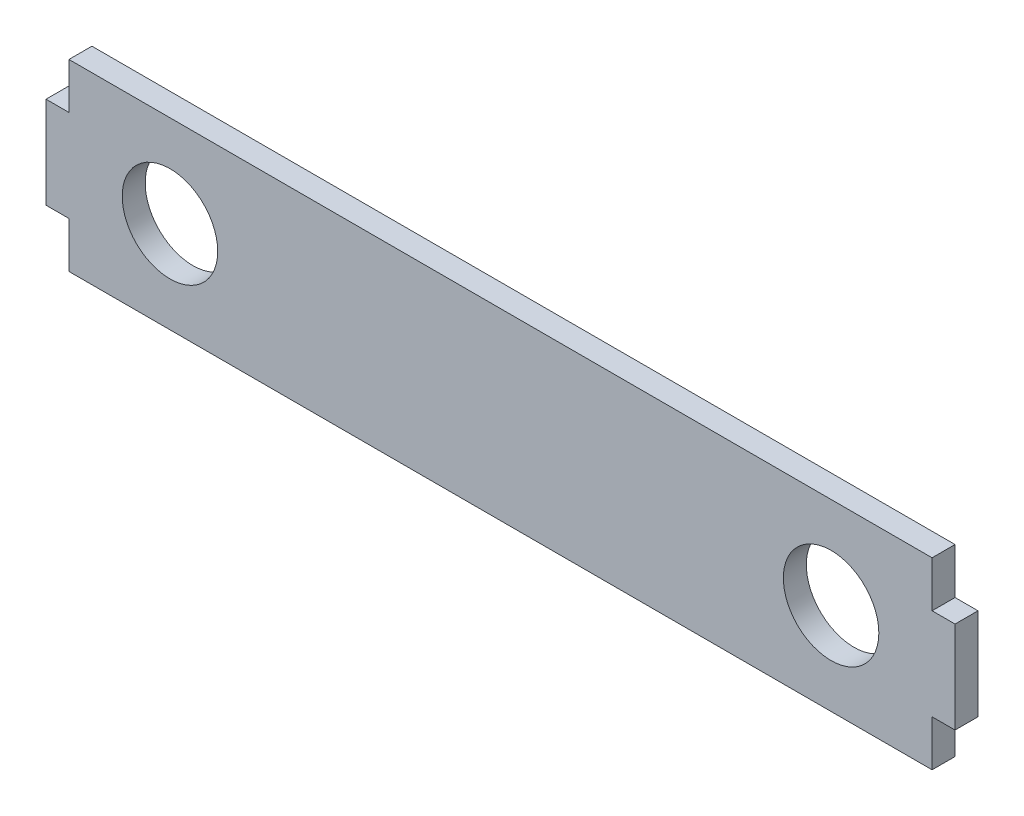
ISO-10303-21;
HEADER;
FILE_DESCRIPTION(('STEP AP214'),'2;1');
FILE_NAME('part.step','',(''),(''),'','','');
FILE_SCHEMA(('AUTOMOTIVE_DESIGN { 1 0 10303 214 1 1 1 1 }'));
ENDSEC;
DATA;
#1=APPLICATION_CONTEXT('core data for automotive mechanical design processes');
#2=APPLICATION_PROTOCOL_DEFINITION('international standard','automotive_design',2000,#1);
#3=PRODUCT_CONTEXT('',#1,'mechanical');
#4=PRODUCT('Part','Part','',(#3));
#5=PRODUCT_RELATED_PRODUCT_CATEGORY('part','',(#4));
#6=PRODUCT_DEFINITION_FORMATION('','',#4);
#7=PRODUCT_DEFINITION_CONTEXT('part definition',#1,'design');
#8=PRODUCT_DEFINITION('design','',#6,#7);
#9=PRODUCT_DEFINITION_SHAPE('','',#8);
#10=(LENGTH_UNIT() NAMED_UNIT(*) SI_UNIT(.MILLI.,.METRE.));
#11=(NAMED_UNIT(*) PLANE_ANGLE_UNIT() SI_UNIT($,.RADIAN.));
#12=(NAMED_UNIT(*) SI_UNIT($,.STERADIAN.) SOLID_ANGLE_UNIT());
#13=UNCERTAINTY_MEASURE_WITH_UNIT(LENGTH_MEASURE(1.E-05),#10,'distance_accuracy_value','');
#14=(GEOMETRIC_REPRESENTATION_CONTEXT(3) GLOBAL_UNCERTAINTY_ASSIGNED_CONTEXT((#13)) GLOBAL_UNIT_ASSIGNED_CONTEXT((#10,
#11,#12)) REPRESENTATION_CONTEXT('',''));
#15=CARTESIAN_POINT('',(0.,0.,0.));
#16=DIRECTION('',(0.,0.,1.));
#17=DIRECTION('',(1.,0.,0.));
#18=AXIS2_PLACEMENT_3D('',#15,#16,#17);
#19=CARTESIAN_POINT('',(-29.845,0.,-1.5875));
#20=DIRECTION('',(1.,0.,0.));
#21=DIRECTION('',(0.,0.,-1.));
#22=AXIS2_PLACEMENT_3D('',#19,#20,#21);
#23=PLANE('',#22);
#24=DIRECTION('',(0.,1.,0.));
#25=VECTOR('',#24,1.);
#26=CARTESIAN_POINT('',(-29.845,0.,0.));
#27=LINE('',#26,#25);
#28=CARTESIAN_POINT('',(-29.845,3.175,0.));
#29=VERTEX_POINT('',#28);
#30=CARTESIAN_POINT('',(-29.845,6.35,0.));
#31=VERTEX_POINT('',#30);
#32=EDGE_CURVE('E167',#29,#31,#27,.T.);
#33=ORIENTED_EDGE('',*,*,#32,.T.);
#34=DIRECTION('',(0.,0.,1.));
#35=VECTOR('',#34,1.);
#36=CARTESIAN_POINT('',(-29.845,6.35,-1.5875));
#37=LINE('',#36,#35);
#38=CARTESIAN_POINT('',(-29.845,6.35,-1.5875));
#39=VERTEX_POINT('',#38);
#40=EDGE_CURVE('E11',#39,#31,#37,.T.);
#41=ORIENTED_EDGE('',*,*,#40,.F.);
#42=DIRECTION('',(0.,1.,0.));
#43=VECTOR('',#42,1.);
#44=CARTESIAN_POINT('',(-29.845,0.,-1.5875));
#45=LINE('',#44,#43);
#46=CARTESIAN_POINT('',(-29.845,3.175,-1.5875));
#47=VERTEX_POINT('',#46);
#48=EDGE_CURVE('E60',#47,#39,#45,.T.);
#49=ORIENTED_EDGE('',*,*,#48,.F.);
#50=DIRECTION('',(0.,0.,1.));
#51=VECTOR('',#50,1.);
#52=CARTESIAN_POINT('',(-29.845,3.175,-1.5875));
#53=LINE('',#52,#51);
#54=EDGE_CURVE('E45',#47,#29,#53,.T.);
#55=ORIENTED_EDGE('',*,*,#54,.T.);
#56=EDGE_LOOP('',(#33,#41,#49,#55));
#57=FACE_BOUND('',#56,.T.);
#58=ADVANCED_FACE('F41',(#57),#23,.F.);
#59=CARTESIAN_POINT('',(0.,6.35,-1.5875));
#60=DIRECTION('',(0.,1.,0.));
#61=DIRECTION('',(0.,0.,1.));
#62=AXIS2_PLACEMENT_3D('',#59,#60,#61);
#63=PLANE('',#62);
#64=DIRECTION('',(-1.,0.,0.));
#65=VECTOR('',#64,1.);
#66=CARTESIAN_POINT('',(0.,6.35,0.));
#67=LINE('',#66,#65);
#68=CARTESIAN_POINT('',(29.845,6.35,0.));
#69=VERTEX_POINT('',#68);
#70=EDGE_CURVE('E195',#69,#31,#67,.T.);
#71=ORIENTED_EDGE('',*,*,#70,.F.);
#72=DIRECTION('',(0.,0.,1.));
#73=VECTOR('',#72,1.);
#74=CARTESIAN_POINT('',(29.845,6.35,-1.5875));
#75=LINE('',#74,#73);
#76=CARTESIAN_POINT('',(29.845,6.35,-1.5875));
#77=VERTEX_POINT('',#76);
#78=EDGE_CURVE('E51',#77,#69,#75,.T.);
#79=ORIENTED_EDGE('',*,*,#78,.F.);
#80=DIRECTION('',(-1.,0.,0.));
#81=VECTOR('',#80,1.);
#82=CARTESIAN_POINT('',(0.,6.35,-1.5875));
#83=LINE('',#82,#81);
#84=EDGE_CURVE('E156',#77,#39,#83,.T.);
#85=ORIENTED_EDGE('',*,*,#84,.T.);
#86=ORIENTED_EDGE('',*,*,#40,.T.);
#87=EDGE_LOOP('',(#71,#79,#85,#86));
#88=FACE_BOUND('',#87,.T.);
#89=ADVANCED_FACE('F233',(#88),#63,.T.);
#90=CARTESIAN_POINT('',(29.845,0.,-1.5875));
#91=DIRECTION('',(1.,0.,0.));
#92=DIRECTION('',(0.,1.,0.));
#93=AXIS2_PLACEMENT_3D('',#90,#91,#92);
#94=PLANE('',#93);
#95=DIRECTION('',(0.,1.,0.));
#96=VECTOR('',#95,1.);
#97=CARTESIAN_POINT('',(29.845,0.,0.));
#98=LINE('',#97,#96);
#99=CARTESIAN_POINT('',(29.845,3.175,0.));
#100=VERTEX_POINT('',#99);
#101=EDGE_CURVE('E142',#100,#69,#98,.T.);
#102=ORIENTED_EDGE('',*,*,#101,.F.);
#103=DIRECTION('',(0.,0.,1.));
#104=VECTOR('',#103,1.);
#105=CARTESIAN_POINT('',(29.845,3.175,-1.5875));
#106=LINE('',#105,#104);
#107=CARTESIAN_POINT('',(29.845,3.175,-1.5875));
#108=VERTEX_POINT('',#107);
#109=EDGE_CURVE('E137',#108,#100,#106,.T.);
#110=ORIENTED_EDGE('',*,*,#109,.F.);
#111=DIRECTION('',(0.,1.,0.));
#112=VECTOR('',#111,1.);
#113=CARTESIAN_POINT('',(29.845,0.,-1.5875));
#114=LINE('',#113,#112);
#115=EDGE_CURVE('E141',#108,#77,#114,.T.);
#116=ORIENTED_EDGE('',*,*,#115,.T.);
#117=ORIENTED_EDGE('',*,*,#78,.T.);
#118=EDGE_LOOP('',(#102,#110,#116,#117));
#119=FACE_BOUND('',#118,.T.);
#120=ADVANCED_FACE('F139',(#119),#94,.T.);
#121=CARTESIAN_POINT('',(0.,3.175,-1.5875));
#122=DIRECTION('',(0.,-1.,0.));
#123=DIRECTION('',(0.,0.,-1.));
#124=AXIS2_PLACEMENT_3D('',#121,#122,#123);
#125=PLANE('',#124);
#126=DIRECTION('',(1.,0.,0.));
#127=VECTOR('',#126,1.);
#128=CARTESIAN_POINT('',(0.,3.175,0.));
#129=LINE('',#128,#127);
#130=CARTESIAN_POINT('',(31.4325,3.175,0.));
#131=VERTEX_POINT('',#130);
#132=EDGE_CURVE('E192',#100,#131,#129,.T.);
#133=ORIENTED_EDGE('',*,*,#132,.T.);
#134=DIRECTION('',(0.,0.,1.));
#135=VECTOR('',#134,1.);
#136=CARTESIAN_POINT('',(31.4325,3.175,-1.5875));
#137=LINE('',#136,#135);
#138=CARTESIAN_POINT('',(31.4325,3.175,-1.5875));
#139=VERTEX_POINT('',#138);
#140=EDGE_CURVE('E146',#139,#131,#137,.T.);
#141=ORIENTED_EDGE('',*,*,#140,.F.);
#142=DIRECTION('',(1.,0.,0.));
#143=VECTOR('',#142,1.);
#144=CARTESIAN_POINT('',(0.,3.175,-1.5875));
#145=LINE('',#144,#143);
#146=EDGE_CURVE('E149',#108,#139,#145,.T.);
#147=ORIENTED_EDGE('',*,*,#146,.F.);
#148=ORIENTED_EDGE('',*,*,#109,.T.);
#149=EDGE_LOOP('',(#133,#141,#147,#148));
#150=FACE_BOUND('',#149,.T.);
#151=ADVANCED_FACE('F150',(#150),#125,.F.);
#152=CARTESIAN_POINT('',(31.4325,0.,-1.5875));
#153=DIRECTION('',(1.,0.,0.));
#154=DIRECTION('',(0.,0.,-1.));
#155=AXIS2_PLACEMENT_3D('',#152,#153,#154);
#156=PLANE('',#155);
#157=DIRECTION('',(0.,1.,0.));
#158=VECTOR('',#157,1.);
#159=CARTESIAN_POINT('',(31.4325,0.,0.));
#160=LINE('',#159,#158);
#161=CARTESIAN_POINT('',(31.4325,-3.175,0.));
#162=VERTEX_POINT('',#161);
#163=EDGE_CURVE('E189',#162,#131,#160,.T.);
#164=ORIENTED_EDGE('',*,*,#163,.F.);
#165=DIRECTION('',(0.,0.,1.));
#166=VECTOR('',#165,1.);
#167=CARTESIAN_POINT('',(31.4325,-3.175,-1.5875));
#168=LINE('',#167,#166);
#169=CARTESIAN_POINT('',(31.4325,-3.175,-1.5875));
#170=VERTEX_POINT('',#169);
#171=EDGE_CURVE('E201',#170,#162,#168,.T.);
#172=ORIENTED_EDGE('',*,*,#171,.F.);
#173=DIRECTION('',(0.,1.,0.));
#174=VECTOR('',#173,1.);
#175=CARTESIAN_POINT('',(31.4325,0.,-1.5875));
#176=LINE('',#175,#174);
#177=EDGE_CURVE('E153',#170,#139,#176,.T.);
#178=ORIENTED_EDGE('',*,*,#177,.T.);
#179=ORIENTED_EDGE('',*,*,#140,.T.);
#180=EDGE_LOOP('',(#164,#172,#178,#179));
#181=FACE_BOUND('',#180,.T.);
#182=ADVANCED_FACE('F263',(#181),#156,.T.);
#183=CARTESIAN_POINT('',(0.,-3.175,-1.5875));
#184=DIRECTION('',(0.,1.,0.));
#185=DIRECTION('',(0.,0.,1.));
#186=AXIS2_PLACEMENT_3D('',#183,#184,#185);
#187=PLANE('',#186);
#188=DIRECTION('',(-1.,0.,0.));
#189=VECTOR('',#188,1.);
#190=CARTESIAN_POINT('',(0.,-3.175,0.));
#191=LINE('',#190,#189);
#192=CARTESIAN_POINT('',(29.845,-3.175,0.));
#193=VERTEX_POINT('',#192);
#194=EDGE_CURVE('E187',#162,#193,#191,.T.);
#195=ORIENTED_EDGE('',*,*,#194,.T.);
#196=DIRECTION('',(0.,0.,1.));
#197=VECTOR('',#196,1.);
#198=CARTESIAN_POINT('',(29.845,-3.175,-1.5875));
#199=LINE('',#198,#197);
#200=CARTESIAN_POINT('',(29.845,-3.175,-1.5875));
#201=VERTEX_POINT('',#200);
#202=EDGE_CURVE('E203',#201,#193,#199,.T.);
#203=ORIENTED_EDGE('',*,*,#202,.F.);
#204=DIRECTION('',(-1.,0.,0.));
#205=VECTOR('',#204,1.);
#206=CARTESIAN_POINT('',(0.,-3.175,-1.5875));
#207=LINE('',#206,#205);
#208=EDGE_CURVE('E309',#170,#201,#207,.T.);
#209=ORIENTED_EDGE('',*,*,#208,.F.);
#210=ORIENTED_EDGE('',*,*,#171,.T.);
#211=EDGE_LOOP('',(#195,#203,#209,#210));
#212=FACE_BOUND('',#211,.T.);
#213=ADVANCED_FACE('F266',(#212),#187,.F.);
#214=CARTESIAN_POINT('',(29.845,0.,-1.5875));
#215=DIRECTION('',(-1.,0.,0.));
#216=DIRECTION('',(0.,-1.,0.));
#217=AXIS2_PLACEMENT_3D('',#214,#215,#216);
#218=PLANE('',#217);
#219=DIRECTION('',(0.,-1.,0.));
#220=VECTOR('',#219,1.);
#221=CARTESIAN_POINT('',(29.845,0.,0.));
#222=LINE('',#221,#220);
#223=CARTESIAN_POINT('',(29.845,-6.35,0.));
#224=VERTEX_POINT('',#223);
#225=EDGE_CURVE('E184',#193,#224,#222,.T.);
#226=ORIENTED_EDGE('',*,*,#225,.T.);
#227=DIRECTION('',(0.,0.,1.));
#228=VECTOR('',#227,1.);
#229=CARTESIAN_POINT('',(29.845,-6.35,-1.5875));
#230=LINE('',#229,#228);
#231=CARTESIAN_POINT('',(29.845,-6.35,-1.5875));
#232=VERTEX_POINT('',#231);
#233=EDGE_CURVE('E206',#232,#224,#230,.T.);
#234=ORIENTED_EDGE('',*,*,#233,.F.);
#235=DIRECTION('',(0.,-1.,0.));
#236=VECTOR('',#235,1.);
#237=CARTESIAN_POINT('',(29.845,0.,-1.5875));
#238=LINE('',#237,#236);
#239=EDGE_CURVE('E307',#201,#232,#238,.T.);
#240=ORIENTED_EDGE('',*,*,#239,.F.);
#241=ORIENTED_EDGE('',*,*,#202,.T.);
#242=EDGE_LOOP('',(#226,#234,#240,#241));
#243=FACE_BOUND('',#242,.T.);
#244=ADVANCED_FACE('F270',(#243),#218,.F.);
#245=CARTESIAN_POINT('',(0.,-6.35,-1.5875));
#246=DIRECTION('',(0.,-1.,0.));
#247=DIRECTION('',(0.,0.,-1.));
#248=AXIS2_PLACEMENT_3D('',#245,#246,#247);
#249=PLANE('',#248);
#250=DIRECTION('',(1.,0.,0.));
#251=VECTOR('',#250,1.);
#252=CARTESIAN_POINT('',(0.,-6.35,0.));
#253=LINE('',#252,#251);
#254=CARTESIAN_POINT('',(-29.845,-6.35,0.));
#255=VERTEX_POINT('',#254);
#256=EDGE_CURVE('E181',#255,#224,#253,.T.);
#257=ORIENTED_EDGE('',*,*,#256,.F.);
#258=DIRECTION('',(0.,0.,1.));
#259=VECTOR('',#258,1.);
#260=CARTESIAN_POINT('',(-29.845,-6.35,-1.5875));
#261=LINE('',#260,#259);
#262=CARTESIAN_POINT('',(-29.845,-6.35,-1.5875));
#263=VERTEX_POINT('',#262);
#264=EDGE_CURVE('E208',#263,#255,#261,.T.);
#265=ORIENTED_EDGE('',*,*,#264,.F.);
#266=DIRECTION('',(1.,0.,0.));
#267=VECTOR('',#266,1.);
#268=CARTESIAN_POINT('',(0.,-6.35,-1.5875));
#269=LINE('',#268,#267);
#270=EDGE_CURVE('E304',#263,#232,#269,.T.);
#271=ORIENTED_EDGE('',*,*,#270,.T.);
#272=ORIENTED_EDGE('',*,*,#233,.T.);
#273=EDGE_LOOP('',(#257,#265,#271,#272));
#274=FACE_BOUND('',#273,.T.);
#275=ADVANCED_FACE('F274',(#274),#249,.T.);
#276=CARTESIAN_POINT('',(-29.845,0.,-1.5875));
#277=DIRECTION('',(-1.,0.,0.));
#278=DIRECTION('',(0.,-1.,0.));
#279=AXIS2_PLACEMENT_3D('',#276,#277,#278);
#280=PLANE('',#279);
#281=DIRECTION('',(0.,-1.,0.));
#282=VECTOR('',#281,1.);
#283=CARTESIAN_POINT('',(-29.845,0.,0.));
#284=LINE('',#283,#282);
#285=CARTESIAN_POINT('',(-29.845,-3.175,0.));
#286=VERTEX_POINT('',#285);
#287=EDGE_CURVE('E178',#286,#255,#284,.T.);
#288=ORIENTED_EDGE('',*,*,#287,.F.);
#289=DIRECTION('',(0.,0.,1.));
#290=VECTOR('',#289,1.);
#291=CARTESIAN_POINT('',(-29.845,-3.175,-1.5875));
#292=LINE('',#291,#290);
#293=CARTESIAN_POINT('',(-29.845,-3.175,-1.5875));
#294=VERTEX_POINT('',#293);
#295=EDGE_CURVE('E210',#294,#286,#292,.T.);
#296=ORIENTED_EDGE('',*,*,#295,.F.);
#297=DIRECTION('',(0.,-1.,0.));
#298=VECTOR('',#297,1.);
#299=CARTESIAN_POINT('',(-29.845,0.,-1.5875));
#300=LINE('',#299,#298);
#301=EDGE_CURVE('E297',#294,#263,#300,.T.);
#302=ORIENTED_EDGE('',*,*,#301,.T.);
#303=ORIENTED_EDGE('',*,*,#264,.T.);
#304=EDGE_LOOP('',(#288,#296,#302,#303));
#305=FACE_BOUND('',#304,.T.);
#306=ADVANCED_FACE('F278',(#305),#280,.T.);
#307=CARTESIAN_POINT('',(0.,-3.175,-1.5875));
#308=DIRECTION('',(0.,-1.,0.));
#309=DIRECTION('',(0.,0.,-1.));
#310=AXIS2_PLACEMENT_3D('',#307,#308,#309);
#311=PLANE('',#310);
#312=DIRECTION('',(1.,0.,0.));
#313=VECTOR('',#312,1.);
#314=CARTESIAN_POINT('',(0.,-3.175,0.));
#315=LINE('',#314,#313);
#316=CARTESIAN_POINT('',(-31.4325,-3.175,0.));
#317=VERTEX_POINT('',#316);
#318=EDGE_CURVE('E175',#317,#286,#315,.T.);
#319=ORIENTED_EDGE('',*,*,#318,.F.);
#320=DIRECTION('',(0.,0.,1.));
#321=VECTOR('',#320,1.);
#322=CARTESIAN_POINT('',(-31.4325,-3.175,-1.5875));
#323=LINE('',#322,#321);
#324=CARTESIAN_POINT('',(-31.4325,-3.175,-1.5875));
#325=VERTEX_POINT('',#324);
#326=EDGE_CURVE('E212',#325,#317,#323,.T.);
#327=ORIENTED_EDGE('',*,*,#326,.F.);
#328=DIRECTION('',(1.,0.,0.));
#329=VECTOR('',#328,1.);
#330=CARTESIAN_POINT('',(0.,-3.175,-1.5875));
#331=LINE('',#330,#329);
#332=EDGE_CURVE('E294',#325,#294,#331,.T.);
#333=ORIENTED_EDGE('',*,*,#332,.T.);
#334=ORIENTED_EDGE('',*,*,#295,.T.);
#335=EDGE_LOOP('',(#319,#327,#333,#334));
#336=FACE_BOUND('',#335,.T.);
#337=ADVANCED_FACE('F244',(#336),#311,.T.);
#338=CARTESIAN_POINT('',(-31.4325,0.,-1.5875));
#339=DIRECTION('',(-1.,0.,0.));
#340=DIRECTION('',(0.,0.,1.));
#341=AXIS2_PLACEMENT_3D('',#338,#339,#340);
#342=PLANE('',#341);
#343=DIRECTION('',(0.,-1.,0.));
#344=VECTOR('',#343,1.);
#345=CARTESIAN_POINT('',(-31.4325,0.,0.));
#346=LINE('',#345,#344);
#347=CARTESIAN_POINT('',(-31.4325,3.175,0.));
#348=VERTEX_POINT('',#347);
#349=EDGE_CURVE('E172',#348,#317,#346,.T.);
#350=ORIENTED_EDGE('',*,*,#349,.F.);
#351=DIRECTION('',(0.,0.,1.));
#352=VECTOR('',#351,1.);
#353=CARTESIAN_POINT('',(-31.4325,3.175,-1.5875));
#354=LINE('',#353,#352);
#355=CARTESIAN_POINT('',(-31.4325,3.175,-1.5875));
#356=VERTEX_POINT('',#355);
#357=EDGE_CURVE('E213',#356,#348,#354,.T.);
#358=ORIENTED_EDGE('',*,*,#357,.F.);
#359=DIRECTION('',(0.,-1.,0.));
#360=VECTOR('',#359,1.);
#361=CARTESIAN_POINT('',(-31.4325,0.,-1.5875));
#362=LINE('',#361,#360);
#363=EDGE_CURVE('E293',#356,#325,#362,.T.);
#364=ORIENTED_EDGE('',*,*,#363,.T.);
#365=ORIENTED_EDGE('',*,*,#326,.T.);
#366=EDGE_LOOP('',(#350,#358,#364,#365));
#367=FACE_BOUND('',#366,.T.);
#368=ADVANCED_FACE('F239',(#367),#342,.T.);
#369=CARTESIAN_POINT('',(22.86,0.,-1.5875));
#370=DIRECTION('',(0.,0.,1.));
#371=DIRECTION('',(1.,0.,0.));
#372=AXIS2_PLACEMENT_3D('',#369,#370,#371);
#373=CYLINDRICAL_SURFACE('',#372,3.302);
#374=CARTESIAN_POINT('',(22.86,0.,-1.5875));
#375=DIRECTION('',(0.,0.,1.));
#376=DIRECTION('',(1.,0.,0.));
#377=AXIS2_PLACEMENT_3D('',#374,#375,#376);
#378=CIRCLE('',#377,3.302);
#379=CARTESIAN_POINT('',(26.162,0.,-1.5875));
#380=VERTEX_POINT('',#379);
#381=EDGE_CURVE('E249',#380,#380,#378,.T.);
#382=ORIENTED_EDGE('',*,*,#381,.F.);
#383=EDGE_LOOP('',(#382));
#384=FACE_BOUND('',#383,.T.);
#385=CARTESIAN_POINT('',(22.86,0.,0.));
#386=DIRECTION('',(0.,0.,1.));
#387=DIRECTION('',(1.,0.,0.));
#388=AXIS2_PLACEMENT_3D('',#385,#386,#387);
#389=CIRCLE('',#388,3.302);
#390=CARTESIAN_POINT('',(26.162,0.,0.));
#391=VERTEX_POINT('',#390);
#392=EDGE_CURVE('E164',#391,#391,#389,.T.);
#393=ORIENTED_EDGE('',*,*,#392,.T.);
#394=EDGE_LOOP('',(#393));
#395=FACE_BOUND('',#394,.T.);
#396=ADVANCED_FACE('F228',(#384,#395),#373,.F.);
#397=CARTESIAN_POINT('',(-22.86,0.,-1.5875));
#398=DIRECTION('',(0.,0.,1.));
#399=DIRECTION('',(1.,0.,0.));
#400=AXIS2_PLACEMENT_3D('',#397,#398,#399);
#401=CYLINDRICAL_SURFACE('',#400,3.302);
#402=CARTESIAN_POINT('',(-22.86,0.,-1.5875));
#403=DIRECTION('',(0.,0.,1.));
#404=DIRECTION('',(1.,0.,0.));
#405=AXIS2_PLACEMENT_3D('',#402,#403,#404);
#406=CIRCLE('',#405,3.302);
#407=CARTESIAN_POINT('',(-19.558,0.,-1.5875));
#408=VERTEX_POINT('',#407);
#409=EDGE_CURVE('E197',#408,#408,#406,.T.);
#410=ORIENTED_EDGE('',*,*,#409,.F.);
#411=EDGE_LOOP('',(#410));
#412=FACE_BOUND('',#411,.T.);
#413=CARTESIAN_POINT('',(-22.86,0.,0.));
#414=DIRECTION('',(0.,0.,1.));
#415=DIRECTION('',(1.,0.,0.));
#416=AXIS2_PLACEMENT_3D('',#413,#414,#415);
#417=CIRCLE('',#416,3.302);
#418=CARTESIAN_POINT('',(-19.558,0.,0.));
#419=VERTEX_POINT('',#418);
#420=EDGE_CURVE('E161',#419,#419,#417,.T.);
#421=ORIENTED_EDGE('',*,*,#420,.T.);
#422=EDGE_LOOP('',(#421));
#423=FACE_BOUND('',#422,.T.);
#424=ADVANCED_FACE('F43',(#412,#423),#401,.F.);
#425=CARTESIAN_POINT('',(0.,3.175,-1.5875));
#426=DIRECTION('',(0.,1.,0.));
#427=DIRECTION('',(0.,0.,1.));
#428=AXIS2_PLACEMENT_3D('',#425,#426,#427);
#429=PLANE('',#428);
#430=DIRECTION('',(-1.,0.,0.));
#431=VECTOR('',#430,1.);
#432=CARTESIAN_POINT('',(0.,3.175,0.));
#433=LINE('',#432,#431);
#434=EDGE_CURVE('E169',#29,#348,#433,.T.);
#435=ORIENTED_EDGE('',*,*,#434,.F.);
#436=ORIENTED_EDGE('',*,*,#54,.F.);
#437=DIRECTION('',(-1.,0.,0.));
#438=VECTOR('',#437,1.);
#439=CARTESIAN_POINT('',(0.,3.175,-1.5875));
#440=LINE('',#439,#438);
#441=EDGE_CURVE('E295',#47,#356,#440,.T.);
#442=ORIENTED_EDGE('',*,*,#441,.T.);
#443=ORIENTED_EDGE('',*,*,#357,.T.);
#444=EDGE_LOOP('',(#435,#436,#442,#443));
#445=FACE_BOUND('',#444,.T.);
#446=ADVANCED_FACE('F219',(#445),#429,.T.);
#447=CARTESIAN_POINT('',(0.,0.,-1.5875));
#448=DIRECTION('',(0.,0.,1.));
#449=DIRECTION('',(1.,0.,0.));
#450=AXIS2_PLACEMENT_3D('',#447,#448,#449);
#451=PLANE('',#450);
#452=ORIENTED_EDGE('',*,*,#409,.T.);
#453=EDGE_LOOP('',(#452));
#454=FACE_BOUND('',#453,.T.);
#455=ORIENTED_EDGE('',*,*,#381,.T.);
#456=EDGE_LOOP('',(#455));
#457=FACE_BOUND('',#456,.T.);
#458=ORIENTED_EDGE('',*,*,#48,.T.);
#459=ORIENTED_EDGE('',*,*,#84,.F.);
#460=ORIENTED_EDGE('',*,*,#115,.F.);
#461=ORIENTED_EDGE('',*,*,#146,.T.);
#462=ORIENTED_EDGE('',*,*,#177,.F.);
#463=ORIENTED_EDGE('',*,*,#208,.T.);
#464=ORIENTED_EDGE('',*,*,#239,.T.);
#465=ORIENTED_EDGE('',*,*,#270,.F.);
#466=ORIENTED_EDGE('',*,*,#301,.F.);
#467=ORIENTED_EDGE('',*,*,#332,.F.);
#468=ORIENTED_EDGE('',*,*,#363,.F.);
#469=ORIENTED_EDGE('',*,*,#441,.F.);
#470=EDGE_LOOP('',(#458,#459,#460,#461,#462,#463,#464,#465,#466,#467,#468,#469));
#471=FACE_BOUND('',#470,.T.);
#472=ADVANCED_FACE('F155',(#454,#457,#471),#451,.F.);
#473=CARTESIAN_POINT('',(0.,0.,0.));
#474=DIRECTION('',(0.,0.,1.));
#475=DIRECTION('',(1.,0.,0.));
#476=AXIS2_PLACEMENT_3D('',#473,#474,#475);
#477=PLANE('',#476);
#478=ORIENTED_EDGE('',*,*,#420,.F.);
#479=EDGE_LOOP('',(#478));
#480=FACE_BOUND('',#479,.T.);
#481=ORIENTED_EDGE('',*,*,#392,.F.);
#482=EDGE_LOOP('',(#481));
#483=FACE_BOUND('',#482,.T.);
#484=ORIENTED_EDGE('',*,*,#32,.F.);
#485=ORIENTED_EDGE('',*,*,#434,.T.);
#486=ORIENTED_EDGE('',*,*,#349,.T.);
#487=ORIENTED_EDGE('',*,*,#318,.T.);
#488=ORIENTED_EDGE('',*,*,#287,.T.);
#489=ORIENTED_EDGE('',*,*,#256,.T.);
#490=ORIENTED_EDGE('',*,*,#225,.F.);
#491=ORIENTED_EDGE('',*,*,#194,.F.);
#492=ORIENTED_EDGE('',*,*,#163,.T.);
#493=ORIENTED_EDGE('',*,*,#132,.F.);
#494=ORIENTED_EDGE('',*,*,#101,.T.);
#495=ORIENTED_EDGE('',*,*,#70,.T.);
#496=EDGE_LOOP('',(#484,#485,#486,#487,#488,#489,#490,#491,#492,#493,#494,#495));
#497=FACE_BOUND('',#496,.T.);
#498=ADVANCED_FACE('F218',(#480,#483,#497),#477,.T.);
#499=CLOSED_SHELL('',(#58,#89,#120,#151,#182,#213,#244,#275,#306,#337,#368,#396,#424,#446,#472,#498));
#500=MANIFOLD_SOLID_BREP('B2',#499);
#501=ADVANCED_BREP_SHAPE_REPRESENTATION('',(#18,#500),#14);
#502=SHAPE_DEFINITION_REPRESENTATION(#9,#501);
ENDSEC;
END-ISO-10303-21;
